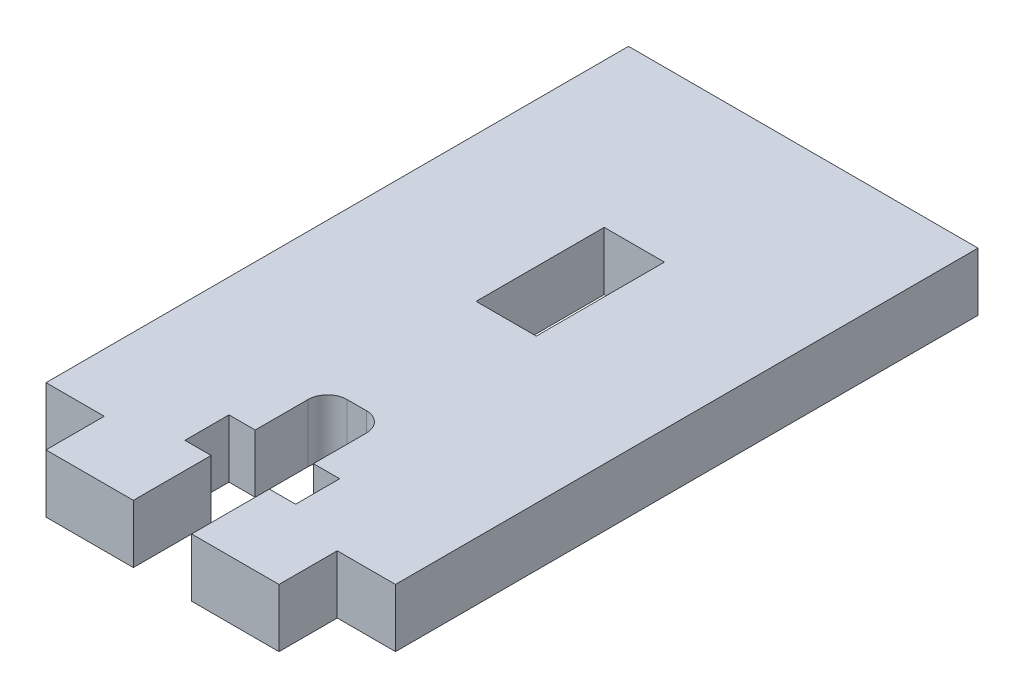
ISO-10303-21;
HEADER;
FILE_DESCRIPTION(('STEP AP214'),'2;1');
FILE_NAME('part.step','',(''),(''),'','','');
FILE_SCHEMA(('AUTOMOTIVE_DESIGN { 1 0 10303 214 1 1 1 1 }'));
ENDSEC;
DATA;
#1=APPLICATION_CONTEXT('core data for automotive mechanical design processes');
#2=APPLICATION_PROTOCOL_DEFINITION('international standard','automotive_design',2000,#1);
#3=PRODUCT_CONTEXT('',#1,'mechanical');
#4=PRODUCT('Part','Part','',(#3));
#5=PRODUCT_RELATED_PRODUCT_CATEGORY('part','',(#4));
#6=PRODUCT_DEFINITION_FORMATION('','',#4);
#7=PRODUCT_DEFINITION_CONTEXT('part definition',#1,'design');
#8=PRODUCT_DEFINITION('design','',#6,#7);
#9=PRODUCT_DEFINITION_SHAPE('','',#8);
#10=(LENGTH_UNIT() NAMED_UNIT(*) SI_UNIT(.MILLI.,.METRE.));
#11=(NAMED_UNIT(*) PLANE_ANGLE_UNIT() SI_UNIT($,.RADIAN.));
#12=(NAMED_UNIT(*) SI_UNIT($,.STERADIAN.) SOLID_ANGLE_UNIT());
#13=UNCERTAINTY_MEASURE_WITH_UNIT(LENGTH_MEASURE(1.E-05),#10,'distance_accuracy_value','');
#14=(GEOMETRIC_REPRESENTATION_CONTEXT(3) GLOBAL_UNCERTAINTY_ASSIGNED_CONTEXT((#13)) GLOBAL_UNIT_ASSIGNED_CONTEXT((#10,
#11,#12)) REPRESENTATION_CONTEXT('',''));
#15=CARTESIAN_POINT('',(0.,0.,0.));
#16=DIRECTION('',(0.,0.,1.));
#17=DIRECTION('',(1.,0.,0.));
#18=AXIS2_PLACEMENT_3D('',#15,#16,#17);
#19=CARTESIAN_POINT('',(-6.,1.5,18.));
#20=DIRECTION('',(0.,0.,-1.));
#21=DIRECTION('',(-1.,0.,0.));
#22=AXIS2_PLACEMENT_3D('',#19,#20,#21);
#23=PLANE('',#22);
#24=DIRECTION('',(1.,0.,0.));
#25=VECTOR('',#24,1.);
#26=CARTESIAN_POINT('',(-6.,-1.5,18.));
#27=LINE('',#26,#25);
#28=CARTESIAN_POINT('',(-6.,-1.5,18.));
#29=VERTEX_POINT('',#28);
#30=CARTESIAN_POINT('',(-1.5,-1.5,18.));
#31=VERTEX_POINT('',#30);
#32=EDGE_CURVE('E367',#29,#31,#27,.T.);
#33=ORIENTED_EDGE('',*,*,#32,.T.);
#34=DIRECTION('',(0.,1.,0.));
#35=VECTOR('',#34,1.);
#36=CARTESIAN_POINT('',(-1.5,-1.5,18.));
#37=LINE('',#36,#35);
#38=CARTESIAN_POINT('',(-1.5,1.5,18.));
#39=VERTEX_POINT('',#38);
#40=EDGE_CURVE('E323',#31,#39,#37,.T.);
#41=ORIENTED_EDGE('',*,*,#40,.T.);
#42=DIRECTION('',(1.,0.,0.));
#43=VECTOR('',#42,1.);
#44=CARTESIAN_POINT('',(-6.,1.5,18.));
#45=LINE('',#44,#43);
#46=CARTESIAN_POINT('',(-6.,1.5,18.));
#47=VERTEX_POINT('',#46);
#48=EDGE_CURVE('E358',#47,#39,#45,.T.);
#49=ORIENTED_EDGE('',*,*,#48,.F.);
#50=DIRECTION('',(0.,-1.,0.));
#51=VECTOR('',#50,1.);
#52=CARTESIAN_POINT('',(-6.,1.5,18.));
#53=LINE('',#52,#51);
#54=EDGE_CURVE('E378',#47,#29,#53,.T.);
#55=ORIENTED_EDGE('',*,*,#54,.T.);
#56=EDGE_LOOP('',(#33,#41,#49,#55));
#57=FACE_BOUND('',#56,.T.);
#58=ADVANCED_FACE('F37',(#57),#23,.F.);
#59=CARTESIAN_POINT('',(-9.,1.5,15.));
#60=DIRECTION('',(0.,0.,-1.));
#61=DIRECTION('',(-1.,0.,0.));
#62=AXIS2_PLACEMENT_3D('',#59,#60,#61);
#63=PLANE('',#62);
#64=DIRECTION('',(0.,-1.,0.));
#65=VECTOR('',#64,1.);
#66=CARTESIAN_POINT('',(-6.,1.5,15.));
#67=LINE('',#66,#65);
#68=CARTESIAN_POINT('',(-6.,1.5,15.));
#69=VERTEX_POINT('',#68);
#70=CARTESIAN_POINT('',(-6.,-1.5,15.));
#71=VERTEX_POINT('',#70);
#72=EDGE_CURVE('E363',#69,#71,#67,.T.);
#73=ORIENTED_EDGE('',*,*,#72,.F.);
#74=DIRECTION('',(1.,0.,0.));
#75=VECTOR('',#74,1.);
#76=CARTESIAN_POINT('',(-9.,1.5,15.));
#77=LINE('',#76,#75);
#78=CARTESIAN_POINT('',(-9.,1.5,15.));
#79=VERTEX_POINT('',#78);
#80=EDGE_CURVE('E387',#79,#69,#77,.T.);
#81=ORIENTED_EDGE('',*,*,#80,.F.);
#82=DIRECTION('',(0.,-1.,0.));
#83=VECTOR('',#82,1.);
#84=CARTESIAN_POINT('',(-9.,1.5,15.));
#85=LINE('',#84,#83);
#86=CARTESIAN_POINT('',(-9.,-1.5,15.));
#87=VERTEX_POINT('',#86);
#88=EDGE_CURVE('E11',#79,#87,#85,.T.);
#89=ORIENTED_EDGE('',*,*,#88,.T.);
#90=DIRECTION('',(1.,0.,0.));
#91=VECTOR('',#90,1.);
#92=CARTESIAN_POINT('',(-9.,-1.5,15.));
#93=LINE('',#92,#91);
#94=EDGE_CURVE('E398',#87,#71,#93,.T.);
#95=ORIENTED_EDGE('',*,*,#94,.T.);
#96=EDGE_LOOP('',(#73,#81,#89,#95));
#97=FACE_BOUND('',#96,.T.);
#98=ADVANCED_FACE('F499',(#97),#63,.F.);
#99=CARTESIAN_POINT('',(-9.,1.5,-15.));
#100=DIRECTION('',(1.,0.,0.));
#101=DIRECTION('',(0.,0.,-1.));
#102=AXIS2_PLACEMENT_3D('',#99,#100,#101);
#103=PLANE('',#102);
#104=DIRECTION('',(0.,0.,1.));
#105=VECTOR('',#104,1.);
#106=CARTESIAN_POINT('',(-9.,-1.5,-15.));
#107=LINE('',#106,#105);
#108=CARTESIAN_POINT('',(-9.,-1.5,-15.));
#109=VERTEX_POINT('',#108);
#110=EDGE_CURVE('E381',#109,#87,#107,.T.);
#111=ORIENTED_EDGE('',*,*,#110,.T.);
#112=ORIENTED_EDGE('',*,*,#88,.F.);
#113=DIRECTION('',(0.,0.,1.));
#114=VECTOR('',#113,1.);
#115=CARTESIAN_POINT('',(-9.,1.5,-15.));
#116=LINE('',#115,#114);
#117=CARTESIAN_POINT('',(-9.,1.5,-15.));
#118=VERTEX_POINT('',#117);
#119=EDGE_CURVE('E382',#118,#79,#116,.T.);
#120=ORIENTED_EDGE('',*,*,#119,.F.);
#121=DIRECTION('',(0.,-1.,0.));
#122=VECTOR('',#121,1.);
#123=CARTESIAN_POINT('',(-9.,1.5,-15.));
#124=LINE('',#123,#122);
#125=EDGE_CURVE('E394',#118,#109,#124,.T.);
#126=ORIENTED_EDGE('',*,*,#125,.T.);
#127=EDGE_LOOP('',(#111,#112,#120,#126));
#128=FACE_BOUND('',#127,.T.);
#129=ADVANCED_FACE('F39',(#128),#103,.F.);
#130=CARTESIAN_POINT('',(6.,1.5,15.));
#131=VERTEX_POINT('',#130);
#132=CARTESIAN_POINT('',(9.,1.5,15.));
#133=VERTEX_POINT('',#132);
#134=EDGE_CURVE('E385',#131,#133,#77,.T.);
#135=ORIENTED_EDGE('',*,*,#134,.F.);
#136=DIRECTION('',(0.,-1.,0.));
#137=VECTOR('',#136,1.);
#138=CARTESIAN_POINT('',(6.,1.5,15.));
#139=LINE('',#138,#137);
#140=CARTESIAN_POINT('',(6.,-1.5,15.));
#141=VERTEX_POINT('',#140);
#142=EDGE_CURVE('E372',#131,#141,#139,.T.);
#143=ORIENTED_EDGE('',*,*,#142,.T.);
#144=CARTESIAN_POINT('',(9.,-1.5,15.));
#145=VERTEX_POINT('',#144);
#146=EDGE_CURVE('E397',#141,#145,#93,.T.);
#147=ORIENTED_EDGE('',*,*,#146,.T.);
#148=DIRECTION('',(0.,-1.,0.));
#149=VECTOR('',#148,1.);
#150=CARTESIAN_POINT('',(9.,1.5,15.));
#151=LINE('',#150,#149);
#152=EDGE_CURVE('E45',#133,#145,#151,.T.);
#153=ORIENTED_EDGE('',*,*,#152,.F.);
#154=EDGE_LOOP('',(#135,#143,#147,#153));
#155=FACE_BOUND('',#154,.T.);
#156=ADVANCED_FACE('F433',(#155),#63,.F.);
#157=CARTESIAN_POINT('',(9.,1.5,-15.));
#158=DIRECTION('',(-1.,0.,0.));
#159=DIRECTION('',(0.,0.,1.));
#160=AXIS2_PLACEMENT_3D('',#157,#158,#159);
#161=PLANE('',#160);
#162=DIRECTION('',(0.,0.,-1.));
#163=VECTOR('',#162,1.);
#164=CARTESIAN_POINT('',(9.,-1.5,-15.));
#165=LINE('',#164,#163);
#166=CARTESIAN_POINT('',(9.,-1.5,-15.));
#167=VERTEX_POINT('',#166);
#168=EDGE_CURVE('E401',#145,#167,#165,.T.);
#169=ORIENTED_EDGE('',*,*,#168,.T.);
#170=DIRECTION('',(0.,-1.,0.));
#171=VECTOR('',#170,1.);
#172=CARTESIAN_POINT('',(9.,1.5,-15.));
#173=LINE('',#172,#171);
#174=CARTESIAN_POINT('',(9.,1.5,-15.));
#175=VERTEX_POINT('',#174);
#176=EDGE_CURVE('E406',#175,#167,#173,.T.);
#177=ORIENTED_EDGE('',*,*,#176,.F.);
#178=DIRECTION('',(0.,0.,-1.));
#179=VECTOR('',#178,1.);
#180=CARTESIAN_POINT('',(9.,1.5,-15.));
#181=LINE('',#180,#179);
#182=EDGE_CURVE('E390',#133,#175,#181,.T.);
#183=ORIENTED_EDGE('',*,*,#182,.F.);
#184=ORIENTED_EDGE('',*,*,#152,.T.);
#185=EDGE_LOOP('',(#169,#177,#183,#184));
#186=FACE_BOUND('',#185,.T.);
#187=ADVANCED_FACE('F413',(#186),#161,.F.);
#188=CARTESIAN_POINT('',(-9.,1.5,-15.));
#189=DIRECTION('',(0.,0.,1.));
#190=DIRECTION('',(1.,0.,0.));
#191=AXIS2_PLACEMENT_3D('',#188,#189,#190);
#192=PLANE('',#191);
#193=DIRECTION('',(-1.,0.,0.));
#194=VECTOR('',#193,1.);
#195=CARTESIAN_POINT('',(-9.,-1.5,-15.));
#196=LINE('',#195,#194);
#197=EDGE_CURVE('E386',#167,#109,#196,.T.);
#198=ORIENTED_EDGE('',*,*,#197,.T.);
#199=ORIENTED_EDGE('',*,*,#125,.F.);
#200=DIRECTION('',(-1.,0.,0.));
#201=VECTOR('',#200,1.);
#202=CARTESIAN_POINT('',(-9.,1.5,-15.));
#203=LINE('',#202,#201);
#204=EDGE_CURVE('E392',#175,#118,#203,.T.);
#205=ORIENTED_EDGE('',*,*,#204,.F.);
#206=ORIENTED_EDGE('',*,*,#176,.T.);
#207=EDGE_LOOP('',(#198,#199,#205,#206));
#208=FACE_BOUND('',#207,.T.);
#209=ADVANCED_FACE('F425',(#208),#192,.F.);
#210=CARTESIAN_POINT('',(0.,1.5,0.));
#211=DIRECTION('',(0.,1.,0.));
#212=DIRECTION('',(0.,0.,1.));
#213=AXIS2_PLACEMENT_3D('',#210,#211,#212);
#214=PLANE('',#213);
#215=DIRECTION('',(0.,0.,1.));
#216=VECTOR('',#215,1.);
#217=CARTESIAN_POINT('',(-1.55,1.5,-6.3));
#218=LINE('',#217,#216);
#219=CARTESIAN_POINT('',(-1.55,1.5,-6.3));
#220=VERTEX_POINT('',#219);
#221=CARTESIAN_POINT('',(-1.55,1.5,0.299999999999996));
#222=VERTEX_POINT('',#221);
#223=EDGE_CURVE('E52',#220,#222,#218,.T.);
#224=ORIENTED_EDGE('',*,*,#223,.F.);
#225=DIRECTION('',(-1.,0.,0.));
#226=VECTOR('',#225,1.);
#227=CARTESIAN_POINT('',(-1.55,1.5,-6.3));
#228=LINE('',#227,#226);
#229=CARTESIAN_POINT('',(1.55,1.5,-6.3));
#230=VERTEX_POINT('',#229);
#231=EDGE_CURVE('E228',#230,#220,#228,.T.);
#232=ORIENTED_EDGE('',*,*,#231,.F.);
#233=DIRECTION('',(0.,0.,-1.));
#234=VECTOR('',#233,1.);
#235=CARTESIAN_POINT('',(1.55,1.5,-6.3));
#236=LINE('',#235,#234);
#237=CARTESIAN_POINT('',(1.55,1.5,0.299999999999996));
#238=VERTEX_POINT('',#237);
#239=EDGE_CURVE('E212',#238,#230,#236,.T.);
#240=ORIENTED_EDGE('',*,*,#239,.F.);
#241=DIRECTION('',(1.,0.,0.));
#242=VECTOR('',#241,1.);
#243=CARTESIAN_POINT('',(-1.55,1.5,0.299999999999996));
#244=LINE('',#243,#242);
#245=EDGE_CURVE('E221',#222,#238,#244,.T.);
#246=ORIENTED_EDGE('',*,*,#245,.F.);
#247=EDGE_LOOP('',(#224,#232,#240,#246));
#248=FACE_BOUND('',#247,.T.);
#249=DIRECTION('',(0.,0.,1.));
#250=VECTOR('',#249,1.);
#251=CARTESIAN_POINT('',(-1.5,1.5,18.));
#252=LINE('',#251,#250);
#253=CARTESIAN_POINT('',(-1.5,1.5,13.996114825644));
#254=VERTEX_POINT('',#253);
#255=EDGE_CURVE('E244',#254,#39,#252,.T.);
#256=ORIENTED_EDGE('',*,*,#255,.F.);
#257=DIRECTION('',(1.,0.,0.));
#258=VECTOR('',#257,1.);
#259=CARTESIAN_POINT('',(-2.85,1.5,13.996114825644));
#260=LINE('',#259,#258);
#261=CARTESIAN_POINT('',(-2.85,1.5,13.996114825644));
#262=VERTEX_POINT('',#261);
#263=EDGE_CURVE('E281',#262,#254,#260,.T.);
#264=ORIENTED_EDGE('',*,*,#263,.F.);
#265=DIRECTION('',(0.,0.,1.));
#266=VECTOR('',#265,1.);
#267=CARTESIAN_POINT('',(-2.85,1.5,11.726114825644));
#268=LINE('',#267,#266);
#269=CARTESIAN_POINT('',(-2.85,1.5,11.726114825644));
#270=VERTEX_POINT('',#269);
#271=EDGE_CURVE('E278',#270,#262,#268,.T.);
#272=ORIENTED_EDGE('',*,*,#271,.F.);
#273=DIRECTION('',(-1.,0.,0.));
#274=VECTOR('',#273,1.);
#275=CARTESIAN_POINT('',(-2.85,1.5,11.726114825644));
#276=LINE('',#275,#274);
#277=CARTESIAN_POINT('',(-1.5,1.5,11.726114825644));
#278=VERTEX_POINT('',#277);
#279=EDGE_CURVE('E275',#278,#270,#276,.T.);
#280=ORIENTED_EDGE('',*,*,#279,.F.);
#281=DIRECTION('',(0.,0.,1.));
#282=VECTOR('',#281,1.);
#283=CARTESIAN_POINT('',(-1.5,1.5,11.726114825644));
#284=LINE('',#283,#282);
#285=CARTESIAN_POINT('',(-1.5,1.5,9.));
#286=VERTEX_POINT('',#285);
#287=EDGE_CURVE('E272',#286,#278,#284,.T.);
#288=ORIENTED_EDGE('',*,*,#287,.F.);
#289=CARTESIAN_POINT('',(-0.5,1.5,8.99999999999999));
#290=DIRECTION('',(0.,1.,0.));
#291=DIRECTION('',(0.,0.,-1.));
#292=AXIS2_PLACEMENT_3D('',#289,#290,#291);
#293=CIRCLE('',#292,1.);
#294=CARTESIAN_POINT('',(-0.499999999999992,1.5,7.99999999999999));
#295=VERTEX_POINT('',#294);
#296=EDGE_CURVE('E269',#295,#286,#293,.T.);
#297=ORIENTED_EDGE('',*,*,#296,.F.);
#298=DIRECTION('',(-1.,0.,0.));
#299=VECTOR('',#298,1.);
#300=CARTESIAN_POINT('',(-0.499999999999992,1.5,7.99999999999999));
#301=LINE('',#300,#299);
#302=CARTESIAN_POINT('',(0.499999999999994,1.5,7.99999999999999));
#303=VERTEX_POINT('',#302);
#304=EDGE_CURVE('E266',#303,#295,#301,.T.);
#305=ORIENTED_EDGE('',*,*,#304,.F.);
#306=CARTESIAN_POINT('',(0.500000000000001,1.5,8.99999999999999));
#307=DIRECTION('',(0.,1.,0.));
#308=DIRECTION('',(0.,0.,-1.));
#309=AXIS2_PLACEMENT_3D('',#306,#307,#308);
#310=CIRCLE('',#309,1.);
#311=CARTESIAN_POINT('',(1.5,1.5,9.));
#312=VERTEX_POINT('',#311);
#313=EDGE_CURVE('E263',#312,#303,#310,.T.);
#314=ORIENTED_EDGE('',*,*,#313,.F.);
#315=DIRECTION('',(0.,0.,-1.));
#316=VECTOR('',#315,1.);
#317=CARTESIAN_POINT('',(1.5,1.5,11.726114825644));
#318=LINE('',#317,#316);
#319=CARTESIAN_POINT('',(1.5,1.5,11.726114825644));
#320=VERTEX_POINT('',#319);
#321=EDGE_CURVE('E260',#320,#312,#318,.T.);
#322=ORIENTED_EDGE('',*,*,#321,.F.);
#323=DIRECTION('',(-1.,0.,0.));
#324=VECTOR('',#323,1.);
#325=CARTESIAN_POINT('',(1.5,1.5,11.726114825644));
#326=LINE('',#325,#324);
#327=CARTESIAN_POINT('',(2.85,1.5,11.726114825644));
#328=VERTEX_POINT('',#327);
#329=EDGE_CURVE('E257',#328,#320,#326,.T.);
#330=ORIENTED_EDGE('',*,*,#329,.F.);
#331=DIRECTION('',(0.,0.,-1.));
#332=VECTOR('',#331,1.);
#333=CARTESIAN_POINT('',(2.85,1.5,11.726114825644));
#334=LINE('',#333,#332);
#335=CARTESIAN_POINT('',(2.85,1.5,13.996114825644));
#336=VERTEX_POINT('',#335);
#337=EDGE_CURVE('E254',#336,#328,#334,.T.);
#338=ORIENTED_EDGE('',*,*,#337,.F.);
#339=DIRECTION('',(1.,0.,0.));
#340=VECTOR('',#339,1.);
#341=CARTESIAN_POINT('',(1.5,1.5,13.996114825644));
#342=LINE('',#341,#340);
#343=CARTESIAN_POINT('',(1.5,1.5,13.996114825644));
#344=VERTEX_POINT('',#343);
#345=EDGE_CURVE('E251',#344,#336,#342,.T.);
#346=ORIENTED_EDGE('',*,*,#345,.F.);
#347=DIRECTION('',(0.,0.,-1.));
#348=VECTOR('',#347,1.);
#349=CARTESIAN_POINT('',(1.5,1.5,18.));
#350=LINE('',#349,#348);
#351=CARTESIAN_POINT('',(1.5,1.5,18.));
#352=VERTEX_POINT('',#351);
#353=EDGE_CURVE('E248',#352,#344,#350,.T.);
#354=ORIENTED_EDGE('',*,*,#353,.F.);
#355=CARTESIAN_POINT('',(6.,1.5,18.));
#356=VERTEX_POINT('',#355);
#357=EDGE_CURVE('E356',#352,#356,#45,.T.);
#358=ORIENTED_EDGE('',*,*,#357,.T.);
#359=DIRECTION('',(0.,0.,-1.));
#360=VECTOR('',#359,1.);
#361=CARTESIAN_POINT('',(6.,1.5,15.));
#362=LINE('',#361,#360);
#363=EDGE_CURVE('E361',#356,#131,#362,.T.);
#364=ORIENTED_EDGE('',*,*,#363,.T.);
#365=ORIENTED_EDGE('',*,*,#134,.T.);
#366=ORIENTED_EDGE('',*,*,#182,.T.);
#367=ORIENTED_EDGE('',*,*,#204,.T.);
#368=ORIENTED_EDGE('',*,*,#119,.T.);
#369=ORIENTED_EDGE('',*,*,#80,.T.);
#370=DIRECTION('',(0.,0.,1.));
#371=VECTOR('',#370,1.);
#372=CARTESIAN_POINT('',(-6.,1.5,15.));
#373=LINE('',#372,#371);
#374=EDGE_CURVE('E353',#69,#47,#373,.T.);
#375=ORIENTED_EDGE('',*,*,#374,.T.);
#376=ORIENTED_EDGE('',*,*,#48,.T.);
#377=EDGE_LOOP('',(#256,#264,#272,#280,#288,#297,#305,#314,#322,#330,#338,#346,#354,#358,#364,
#365,#366,#367,#368,#369,#375,#376));
#378=FACE_BOUND('',#377,.T.);
#379=ADVANCED_FACE('F225',(#248,#378),#214,.T.);
#380=CARTESIAN_POINT('',(0.,-1.5,0.));
#381=DIRECTION('',(0.,1.,0.));
#382=DIRECTION('',(0.,0.,1.));
#383=AXIS2_PLACEMENT_3D('',#380,#381,#382);
#384=PLANE('',#383);
#385=DIRECTION('',(-1.,0.,0.));
#386=VECTOR('',#385,1.);
#387=CARTESIAN_POINT('',(-1.55,-1.5,-6.3));
#388=LINE('',#387,#386);
#389=CARTESIAN_POINT('',(1.55,-1.5,-6.3));
#390=VERTEX_POINT('',#389);
#391=CARTESIAN_POINT('',(-1.55,-1.5,-6.3));
#392=VERTEX_POINT('',#391);
#393=EDGE_CURVE('E239',#390,#392,#388,.T.);
#394=ORIENTED_EDGE('',*,*,#393,.T.);
#395=DIRECTION('',(0.,0.,1.));
#396=VECTOR('',#395,1.);
#397=CARTESIAN_POINT('',(-1.55,-1.5,-6.3));
#398=LINE('',#397,#396);
#399=CARTESIAN_POINT('',(-1.55,-1.5,0.299999999999996));
#400=VERTEX_POINT('',#399);
#401=EDGE_CURVE('E230',#392,#400,#398,.T.);
#402=ORIENTED_EDGE('',*,*,#401,.T.);
#403=DIRECTION('',(1.,0.,0.));
#404=VECTOR('',#403,1.);
#405=CARTESIAN_POINT('',(-1.55,-1.5,0.299999999999996));
#406=LINE('',#405,#404);
#407=CARTESIAN_POINT('',(1.55,-1.5,0.299999999999996));
#408=VERTEX_POINT('',#407);
#409=EDGE_CURVE('E236',#400,#408,#406,.T.);
#410=ORIENTED_EDGE('',*,*,#409,.T.);
#411=DIRECTION('',(0.,0.,-1.));
#412=VECTOR('',#411,1.);
#413=CARTESIAN_POINT('',(1.55,-1.5,-6.3));
#414=LINE('',#413,#412);
#415=EDGE_CURVE('E60',#408,#390,#414,.T.);
#416=ORIENTED_EDGE('',*,*,#415,.T.);
#417=EDGE_LOOP('',(#394,#402,#410,#416));
#418=FACE_BOUND('',#417,.T.);
#419=DIRECTION('',(1.,0.,0.));
#420=VECTOR('',#419,1.);
#421=CARTESIAN_POINT('',(-2.85,-1.5,13.996114825644));
#422=LINE('',#421,#420);
#423=CARTESIAN_POINT('',(-2.85,-1.5,13.996114825644));
#424=VERTEX_POINT('',#423);
#425=CARTESIAN_POINT('',(-1.5,-1.5,13.996114825644));
#426=VERTEX_POINT('',#425);
#427=EDGE_CURVE('E320',#424,#426,#422,.T.);
#428=ORIENTED_EDGE('',*,*,#427,.T.);
#429=DIRECTION('',(0.,0.,1.));
#430=VECTOR('',#429,1.);
#431=CARTESIAN_POINT('',(-1.5,-1.5,18.));
#432=LINE('',#431,#430);
#433=EDGE_CURVE('E284',#426,#31,#432,.T.);
#434=ORIENTED_EDGE('',*,*,#433,.T.);
#435=ORIENTED_EDGE('',*,*,#32,.F.);
#436=DIRECTION('',(0.,0.,1.));
#437=VECTOR('',#436,1.);
#438=CARTESIAN_POINT('',(-6.,-1.5,15.));
#439=LINE('',#438,#437);
#440=EDGE_CURVE('E326',#71,#29,#439,.T.);
#441=ORIENTED_EDGE('',*,*,#440,.F.);
#442=ORIENTED_EDGE('',*,*,#94,.F.);
#443=ORIENTED_EDGE('',*,*,#110,.F.);
#444=ORIENTED_EDGE('',*,*,#197,.F.);
#445=ORIENTED_EDGE('',*,*,#168,.F.);
#446=ORIENTED_EDGE('',*,*,#146,.F.);
#447=DIRECTION('',(0.,0.,-1.));
#448=VECTOR('',#447,1.);
#449=CARTESIAN_POINT('',(6.,-1.5,15.));
#450=LINE('',#449,#448);
#451=CARTESIAN_POINT('',(6.,-1.5,18.));
#452=VERTEX_POINT('',#451);
#453=EDGE_CURVE('E357',#452,#141,#450,.T.);
#454=ORIENTED_EDGE('',*,*,#453,.F.);
#455=CARTESIAN_POINT('',(1.5,-1.5,18.));
#456=VERTEX_POINT('',#455);
#457=EDGE_CURVE('E366',#456,#452,#27,.T.);
#458=ORIENTED_EDGE('',*,*,#457,.F.);
#459=DIRECTION('',(0.,0.,-1.));
#460=VECTOR('',#459,1.);
#461=CARTESIAN_POINT('',(1.5,-1.5,18.));
#462=LINE('',#461,#460);
#463=CARTESIAN_POINT('',(1.5,-1.5,13.996114825644));
#464=VERTEX_POINT('',#463);
#465=EDGE_CURVE('E287',#456,#464,#462,.T.);
#466=ORIENTED_EDGE('',*,*,#465,.T.);
#467=DIRECTION('',(1.,0.,0.));
#468=VECTOR('',#467,1.);
#469=CARTESIAN_POINT('',(1.5,-1.5,13.996114825644));
#470=LINE('',#469,#468);
#471=CARTESIAN_POINT('',(2.85,-1.5,13.996114825644));
#472=VERTEX_POINT('',#471);
#473=EDGE_CURVE('E290',#464,#472,#470,.T.);
#474=ORIENTED_EDGE('',*,*,#473,.T.);
#475=DIRECTION('',(0.,0.,-1.));
#476=VECTOR('',#475,1.);
#477=CARTESIAN_POINT('',(2.85,-1.5,11.726114825644));
#478=LINE('',#477,#476);
#479=CARTESIAN_POINT('',(2.85,-1.5,11.726114825644));
#480=VERTEX_POINT('',#479);
#481=EDGE_CURVE('E293',#472,#480,#478,.T.);
#482=ORIENTED_EDGE('',*,*,#481,.T.);
#483=DIRECTION('',(-1.,0.,0.));
#484=VECTOR('',#483,1.);
#485=CARTESIAN_POINT('',(1.5,-1.5,11.726114825644));
#486=LINE('',#485,#484);
#487=CARTESIAN_POINT('',(1.5,-1.5,11.726114825644));
#488=VERTEX_POINT('',#487);
#489=EDGE_CURVE('E296',#480,#488,#486,.T.);
#490=ORIENTED_EDGE('',*,*,#489,.T.);
#491=DIRECTION('',(0.,0.,-1.));
#492=VECTOR('',#491,1.);
#493=CARTESIAN_POINT('',(1.5,-1.5,11.726114825644));
#494=LINE('',#493,#492);
#495=CARTESIAN_POINT('',(1.5,-1.5,9.));
#496=VERTEX_POINT('',#495);
#497=EDGE_CURVE('E299',#488,#496,#494,.T.);
#498=ORIENTED_EDGE('',*,*,#497,.T.);
#499=CARTESIAN_POINT('',(0.500000000000001,-1.5,8.99999999999999));
#500=DIRECTION('',(0.,1.,0.));
#501=DIRECTION('',(0.,0.,-1.));
#502=AXIS2_PLACEMENT_3D('',#499,#500,#501);
#503=CIRCLE('',#502,1.);
#504=CARTESIAN_POINT('',(0.499999999999994,-1.5,7.99999999999999));
#505=VERTEX_POINT('',#504);
#506=EDGE_CURVE('E302',#496,#505,#503,.T.);
#507=ORIENTED_EDGE('',*,*,#506,.T.);
#508=DIRECTION('',(-1.,0.,0.));
#509=VECTOR('',#508,1.);
#510=CARTESIAN_POINT('',(-0.499999999999992,-1.5,7.99999999999999));
#511=LINE('',#510,#509);
#512=CARTESIAN_POINT('',(-0.499999999999992,-1.5,7.99999999999999));
#513=VERTEX_POINT('',#512);
#514=EDGE_CURVE('E305',#505,#513,#511,.T.);
#515=ORIENTED_EDGE('',*,*,#514,.T.);
#516=CARTESIAN_POINT('',(-0.5,-1.5,8.99999999999999));
#517=DIRECTION('',(0.,1.,0.));
#518=DIRECTION('',(0.,0.,-1.));
#519=AXIS2_PLACEMENT_3D('',#516,#517,#518);
#520=CIRCLE('',#519,1.);
#521=CARTESIAN_POINT('',(-1.5,-1.5,9.));
#522=VERTEX_POINT('',#521);
#523=EDGE_CURVE('E308',#513,#522,#520,.T.);
#524=ORIENTED_EDGE('',*,*,#523,.T.);
#525=DIRECTION('',(0.,0.,1.));
#526=VECTOR('',#525,1.);
#527=CARTESIAN_POINT('',(-1.5,-1.5,11.726114825644));
#528=LINE('',#527,#526);
#529=CARTESIAN_POINT('',(-1.5,-1.5,11.726114825644));
#530=VERTEX_POINT('',#529);
#531=EDGE_CURVE('E311',#522,#530,#528,.T.);
#532=ORIENTED_EDGE('',*,*,#531,.T.);
#533=DIRECTION('',(-1.,0.,0.));
#534=VECTOR('',#533,1.);
#535=CARTESIAN_POINT('',(-2.85,-1.5,11.726114825644));
#536=LINE('',#535,#534);
#537=CARTESIAN_POINT('',(-2.85,-1.5,11.726114825644));
#538=VERTEX_POINT('',#537);
#539=EDGE_CURVE('E314',#530,#538,#536,.T.);
#540=ORIENTED_EDGE('',*,*,#539,.T.);
#541=DIRECTION('',(0.,0.,1.));
#542=VECTOR('',#541,1.);
#543=CARTESIAN_POINT('',(-2.85,-1.5,11.726114825644));
#544=LINE('',#543,#542);
#545=EDGE_CURVE('E317',#538,#424,#544,.T.);
#546=ORIENTED_EDGE('',*,*,#545,.T.);
#547=EDGE_LOOP('',(#428,#434,#435,#441,#442,#443,#444,#445,#446,#454,#458,#466,#474,#482,#490,
#498,#507,#515,#524,#532,#540,#546));
#548=FACE_BOUND('',#547,.T.);
#549=ADVANCED_FACE('F420',(#418,#548),#384,.F.);
#550=CARTESIAN_POINT('',(-6.,1.5,15.));
#551=DIRECTION('',(1.,0.,0.));
#552=DIRECTION('',(0.,0.,-1.));
#553=AXIS2_PLACEMENT_3D('',#550,#551,#552);
#554=PLANE('',#553);
#555=ORIENTED_EDGE('',*,*,#440,.T.);
#556=ORIENTED_EDGE('',*,*,#54,.F.);
#557=ORIENTED_EDGE('',*,*,#374,.F.);
#558=ORIENTED_EDGE('',*,*,#72,.T.);
#559=EDGE_LOOP('',(#555,#556,#557,#558));
#560=FACE_BOUND('',#559,.T.);
#561=ADVANCED_FACE('F496',(#560),#554,.F.);
#562=ORIENTED_EDGE('',*,*,#357,.F.);
#563=DIRECTION('',(0.,1.,0.));
#564=VECTOR('',#563,1.);
#565=CARTESIAN_POINT('',(1.5,-1.5,18.));
#566=LINE('',#565,#564);
#567=EDGE_CURVE('E349',#456,#352,#566,.T.);
#568=ORIENTED_EDGE('',*,*,#567,.F.);
#569=ORIENTED_EDGE('',*,*,#457,.T.);
#570=DIRECTION('',(0.,-1.,0.));
#571=VECTOR('',#570,1.);
#572=CARTESIAN_POINT('',(6.,1.5,18.));
#573=LINE('',#572,#571);
#574=EDGE_CURVE('E375',#356,#452,#573,.T.);
#575=ORIENTED_EDGE('',*,*,#574,.F.);
#576=EDGE_LOOP('',(#562,#568,#569,#575));
#577=FACE_BOUND('',#576,.T.);
#578=ADVANCED_FACE('F441',(#577),#23,.F.);
#579=CARTESIAN_POINT('',(6.,1.5,15.));
#580=DIRECTION('',(-1.,0.,0.));
#581=DIRECTION('',(0.,0.,1.));
#582=AXIS2_PLACEMENT_3D('',#579,#580,#581);
#583=PLANE('',#582);
#584=ORIENTED_EDGE('',*,*,#453,.T.);
#585=ORIENTED_EDGE('',*,*,#142,.F.);
#586=ORIENTED_EDGE('',*,*,#363,.F.);
#587=ORIENTED_EDGE('',*,*,#574,.T.);
#588=EDGE_LOOP('',(#584,#585,#586,#587));
#589=FACE_BOUND('',#588,.T.);
#590=ADVANCED_FACE('F435',(#589),#583,.F.);
#591=CARTESIAN_POINT('',(-1.5,-1.5,18.));
#592=DIRECTION('',(-1.,0.,0.));
#593=DIRECTION('',(0.,0.,1.));
#594=AXIS2_PLACEMENT_3D('',#591,#592,#593);
#595=PLANE('',#594);
#596=ORIENTED_EDGE('',*,*,#40,.F.);
#597=ORIENTED_EDGE('',*,*,#433,.F.);
#598=DIRECTION('',(0.,1.,0.));
#599=VECTOR('',#598,1.);
#600=CARTESIAN_POINT('',(-1.5,-1.5,13.996114825644));
#601=LINE('',#600,#599);
#602=EDGE_CURVE('E324',#426,#254,#601,.T.);
#603=ORIENTED_EDGE('',*,*,#602,.T.);
#604=ORIENTED_EDGE('',*,*,#255,.T.);
#605=EDGE_LOOP('',(#596,#597,#603,#604));
#606=FACE_BOUND('',#605,.T.);
#607=ADVANCED_FACE('F491',(#606),#595,.F.);
#608=CARTESIAN_POINT('',(-2.85,-1.5,13.996114825644));
#609=DIRECTION('',(0.,0.,1.));
#610=DIRECTION('',(1.,0.,0.));
#611=AXIS2_PLACEMENT_3D('',#608,#609,#610);
#612=PLANE('',#611);
#613=ORIENTED_EDGE('',*,*,#602,.F.);
#614=ORIENTED_EDGE('',*,*,#427,.F.);
#615=DIRECTION('',(0.,1.,0.));
#616=VECTOR('',#615,1.);
#617=CARTESIAN_POINT('',(-2.85,-1.5,13.996114825644));
#618=LINE('',#617,#616);
#619=EDGE_CURVE('E327',#424,#262,#618,.T.);
#620=ORIENTED_EDGE('',*,*,#619,.T.);
#621=ORIENTED_EDGE('',*,*,#263,.T.);
#622=EDGE_LOOP('',(#613,#614,#620,#621));
#623=FACE_BOUND('',#622,.T.);
#624=ADVANCED_FACE('F488',(#623),#612,.F.);
#625=CARTESIAN_POINT('',(-2.85,-1.5,11.726114825644));
#626=DIRECTION('',(-1.,0.,0.));
#627=DIRECTION('',(0.,0.,1.));
#628=AXIS2_PLACEMENT_3D('',#625,#626,#627);
#629=PLANE('',#628);
#630=ORIENTED_EDGE('',*,*,#619,.F.);
#631=ORIENTED_EDGE('',*,*,#545,.F.);
#632=DIRECTION('',(0.,1.,0.));
#633=VECTOR('',#632,1.);
#634=CARTESIAN_POINT('',(-2.85,-1.5,11.726114825644));
#635=LINE('',#634,#633);
#636=EDGE_CURVE('E329',#538,#270,#635,.T.);
#637=ORIENTED_EDGE('',*,*,#636,.T.);
#638=ORIENTED_EDGE('',*,*,#271,.T.);
#639=EDGE_LOOP('',(#630,#631,#637,#638));
#640=FACE_BOUND('',#639,.T.);
#641=ADVANCED_FACE('F484',(#640),#629,.F.);
#642=CARTESIAN_POINT('',(-2.85,-1.5,11.726114825644));
#643=DIRECTION('',(0.,0.,-1.));
#644=DIRECTION('',(-1.,0.,0.));
#645=AXIS2_PLACEMENT_3D('',#642,#643,#644);
#646=PLANE('',#645);
#647=ORIENTED_EDGE('',*,*,#636,.F.);
#648=ORIENTED_EDGE('',*,*,#539,.F.);
#649=DIRECTION('',(0.,1.,0.));
#650=VECTOR('',#649,1.);
#651=CARTESIAN_POINT('',(-1.5,-1.5,11.726114825644));
#652=LINE('',#651,#650);
#653=EDGE_CURVE('E331',#530,#278,#652,.T.);
#654=ORIENTED_EDGE('',*,*,#653,.T.);
#655=ORIENTED_EDGE('',*,*,#279,.T.);
#656=EDGE_LOOP('',(#647,#648,#654,#655));
#657=FACE_BOUND('',#656,.T.);
#658=ADVANCED_FACE('F480',(#657),#646,.F.);
#659=CARTESIAN_POINT('',(-1.5,-1.5,11.726114825644));
#660=DIRECTION('',(-1.,0.,0.));
#661=DIRECTION('',(0.,0.,1.));
#662=AXIS2_PLACEMENT_3D('',#659,#660,#661);
#663=PLANE('',#662);
#664=ORIENTED_EDGE('',*,*,#653,.F.);
#665=ORIENTED_EDGE('',*,*,#531,.F.);
#666=DIRECTION('',(0.,1.,0.));
#667=VECTOR('',#666,1.);
#668=CARTESIAN_POINT('',(-1.5,-1.5,9.));
#669=LINE('',#668,#667);
#670=EDGE_CURVE('E333',#522,#286,#669,.T.);
#671=ORIENTED_EDGE('',*,*,#670,.T.);
#672=ORIENTED_EDGE('',*,*,#287,.T.);
#673=EDGE_LOOP('',(#664,#665,#671,#672));
#674=FACE_BOUND('',#673,.T.);
#675=ADVANCED_FACE('F476',(#674),#663,.F.);
#676=CARTESIAN_POINT('',(-0.5,-1.5,8.99999999999999));
#677=DIRECTION('',(0.,1.,0.));
#678=DIRECTION('',(0.,0.,1.));
#679=AXIS2_PLACEMENT_3D('',#676,#677,#678);
#680=CYLINDRICAL_SURFACE('',#679,1.);
#681=ORIENTED_EDGE('',*,*,#670,.F.);
#682=ORIENTED_EDGE('',*,*,#523,.F.);
#683=DIRECTION('',(0.,1.,0.));
#684=VECTOR('',#683,1.);
#685=CARTESIAN_POINT('',(-0.499999999999992,-1.5,7.99999999999999));
#686=LINE('',#685,#684);
#687=EDGE_CURVE('E335',#513,#295,#686,.T.);
#688=ORIENTED_EDGE('',*,*,#687,.T.);
#689=ORIENTED_EDGE('',*,*,#296,.T.);
#690=EDGE_LOOP('',(#681,#682,#688,#689));
#691=FACE_BOUND('',#690,.T.);
#692=ADVANCED_FACE('F472',(#691),#680,.F.);
#693=CARTESIAN_POINT('',(-0.499999999999992,-1.5,7.99999999999999));
#694=DIRECTION('',(0.,0.,-1.));
#695=DIRECTION('',(-1.,0.,0.));
#696=AXIS2_PLACEMENT_3D('',#693,#694,#695);
#697=PLANE('',#696);
#698=ORIENTED_EDGE('',*,*,#687,.F.);
#699=ORIENTED_EDGE('',*,*,#514,.F.);
#700=DIRECTION('',(0.,1.,0.));
#701=VECTOR('',#700,1.);
#702=CARTESIAN_POINT('',(0.499999999999994,-1.5,7.99999999999999));
#703=LINE('',#702,#701);
#704=EDGE_CURVE('E337',#505,#303,#703,.T.);
#705=ORIENTED_EDGE('',*,*,#704,.T.);
#706=ORIENTED_EDGE('',*,*,#304,.T.);
#707=EDGE_LOOP('',(#698,#699,#705,#706));
#708=FACE_BOUND('',#707,.T.);
#709=ADVANCED_FACE('F468',(#708),#697,.F.);
#710=CARTESIAN_POINT('',(0.500000000000001,-1.5,8.99999999999999));
#711=DIRECTION('',(0.,1.,0.));
#712=DIRECTION('',(0.,0.,1.));
#713=AXIS2_PLACEMENT_3D('',#710,#711,#712);
#714=CYLINDRICAL_SURFACE('',#713,1.);
#715=ORIENTED_EDGE('',*,*,#704,.F.);
#716=ORIENTED_EDGE('',*,*,#506,.F.);
#717=DIRECTION('',(0.,1.,0.));
#718=VECTOR('',#717,1.);
#719=CARTESIAN_POINT('',(1.5,-1.5,9.));
#720=LINE('',#719,#718);
#721=EDGE_CURVE('E339',#496,#312,#720,.T.);
#722=ORIENTED_EDGE('',*,*,#721,.T.);
#723=ORIENTED_EDGE('',*,*,#313,.T.);
#724=EDGE_LOOP('',(#715,#716,#722,#723));
#725=FACE_BOUND('',#724,.T.);
#726=ADVANCED_FACE('F464',(#725),#714,.F.);
#727=CARTESIAN_POINT('',(1.5,-1.5,11.726114825644));
#728=DIRECTION('',(1.,0.,0.));
#729=DIRECTION('',(0.,0.,-1.));
#730=AXIS2_PLACEMENT_3D('',#727,#728,#729);
#731=PLANE('',#730);
#732=ORIENTED_EDGE('',*,*,#721,.F.);
#733=ORIENTED_EDGE('',*,*,#497,.F.);
#734=DIRECTION('',(0.,1.,0.));
#735=VECTOR('',#734,1.);
#736=CARTESIAN_POINT('',(1.5,-1.5,11.726114825644));
#737=LINE('',#736,#735);
#738=EDGE_CURVE('E341',#488,#320,#737,.T.);
#739=ORIENTED_EDGE('',*,*,#738,.T.);
#740=ORIENTED_EDGE('',*,*,#321,.T.);
#741=EDGE_LOOP('',(#732,#733,#739,#740));
#742=FACE_BOUND('',#741,.T.);
#743=ADVANCED_FACE('F460',(#742),#731,.F.);
#744=CARTESIAN_POINT('',(1.5,-1.5,11.726114825644));
#745=DIRECTION('',(0.,0.,-1.));
#746=DIRECTION('',(-1.,0.,0.));
#747=AXIS2_PLACEMENT_3D('',#744,#745,#746);
#748=PLANE('',#747);
#749=ORIENTED_EDGE('',*,*,#738,.F.);
#750=ORIENTED_EDGE('',*,*,#489,.F.);
#751=DIRECTION('',(0.,1.,0.));
#752=VECTOR('',#751,1.);
#753=CARTESIAN_POINT('',(2.85,-1.5,11.726114825644));
#754=LINE('',#753,#752);
#755=EDGE_CURVE('E343',#480,#328,#754,.T.);
#756=ORIENTED_EDGE('',*,*,#755,.T.);
#757=ORIENTED_EDGE('',*,*,#329,.T.);
#758=EDGE_LOOP('',(#749,#750,#756,#757));
#759=FACE_BOUND('',#758,.T.);
#760=ADVANCED_FACE('F456',(#759),#748,.F.);
#761=CARTESIAN_POINT('',(2.85,-1.5,11.726114825644));
#762=DIRECTION('',(1.,0.,0.));
#763=DIRECTION('',(0.,0.,-1.));
#764=AXIS2_PLACEMENT_3D('',#761,#762,#763);
#765=PLANE('',#764);
#766=ORIENTED_EDGE('',*,*,#755,.F.);
#767=ORIENTED_EDGE('',*,*,#481,.F.);
#768=DIRECTION('',(0.,1.,0.));
#769=VECTOR('',#768,1.);
#770=CARTESIAN_POINT('',(2.85,-1.5,13.996114825644));
#771=LINE('',#770,#769);
#772=EDGE_CURVE('E345',#472,#336,#771,.T.);
#773=ORIENTED_EDGE('',*,*,#772,.T.);
#774=ORIENTED_EDGE('',*,*,#337,.T.);
#775=EDGE_LOOP('',(#766,#767,#773,#774));
#776=FACE_BOUND('',#775,.T.);
#777=ADVANCED_FACE('F454',(#776),#765,.F.);
#778=CARTESIAN_POINT('',(1.5,-1.5,13.996114825644));
#779=DIRECTION('',(0.,0.,1.));
#780=DIRECTION('',(1.,0.,0.));
#781=AXIS2_PLACEMENT_3D('',#778,#779,#780);
#782=PLANE('',#781);
#783=ORIENTED_EDGE('',*,*,#772,.F.);
#784=ORIENTED_EDGE('',*,*,#473,.F.);
#785=DIRECTION('',(0.,1.,0.));
#786=VECTOR('',#785,1.);
#787=CARTESIAN_POINT('',(1.5,-1.5,13.996114825644));
#788=LINE('',#787,#786);
#789=EDGE_CURVE('E347',#464,#344,#788,.T.);
#790=ORIENTED_EDGE('',*,*,#789,.T.);
#791=ORIENTED_EDGE('',*,*,#345,.T.);
#792=EDGE_LOOP('',(#783,#784,#790,#791));
#793=FACE_BOUND('',#792,.T.);
#794=ADVANCED_FACE('F449',(#793),#782,.F.);
#795=CARTESIAN_POINT('',(1.5,-1.5,18.));
#796=DIRECTION('',(1.,0.,0.));
#797=DIRECTION('',(0.,0.,-1.));
#798=AXIS2_PLACEMENT_3D('',#795,#796,#797);
#799=PLANE('',#798);
#800=ORIENTED_EDGE('',*,*,#789,.F.);
#801=ORIENTED_EDGE('',*,*,#465,.F.);
#802=ORIENTED_EDGE('',*,*,#567,.T.);
#803=ORIENTED_EDGE('',*,*,#353,.T.);
#804=EDGE_LOOP('',(#800,#801,#802,#803));
#805=FACE_BOUND('',#804,.T.);
#806=ADVANCED_FACE('F444',(#805),#799,.F.);
#807=CARTESIAN_POINT('',(-1.55,-1.5,-6.3));
#808=DIRECTION('',(-1.,0.,0.));
#809=DIRECTION('',(0.,0.,1.));
#810=AXIS2_PLACEMENT_3D('',#807,#808,#809);
#811=PLANE('',#810);
#812=DIRECTION('',(0.,1.,0.));
#813=VECTOR('',#812,1.);
#814=CARTESIAN_POINT('',(-1.55,-1.5,0.299999999999996));
#815=LINE('',#814,#813);
#816=EDGE_CURVE('E218',#400,#222,#815,.T.);
#817=ORIENTED_EDGE('',*,*,#816,.F.);
#818=ORIENTED_EDGE('',*,*,#401,.F.);
#819=DIRECTION('',(0.,1.,0.));
#820=VECTOR('',#819,1.);
#821=CARTESIAN_POINT('',(-1.55,-1.5,-6.3));
#822=LINE('',#821,#820);
#823=EDGE_CURVE('E242',#392,#220,#822,.T.);
#824=ORIENTED_EDGE('',*,*,#823,.T.);
#825=ORIENTED_EDGE('',*,*,#223,.T.);
#826=EDGE_LOOP('',(#817,#818,#824,#825));
#827=FACE_BOUND('',#826,.T.);
#828=ADVANCED_FACE('F530',(#827),#811,.F.);
#829=CARTESIAN_POINT('',(-1.55,-1.5,-6.3));
#830=DIRECTION('',(0.,0.,-1.));
#831=DIRECTION('',(-1.,0.,0.));
#832=AXIS2_PLACEMENT_3D('',#829,#830,#831);
#833=PLANE('',#832);
#834=ORIENTED_EDGE('',*,*,#823,.F.);
#835=ORIENTED_EDGE('',*,*,#393,.F.);
#836=DIRECTION('',(0.,1.,0.));
#837=VECTOR('',#836,1.);
#838=CARTESIAN_POINT('',(1.55,-1.5,-6.3));
#839=LINE('',#838,#837);
#840=EDGE_CURVE('E217',#390,#230,#839,.T.);
#841=ORIENTED_EDGE('',*,*,#840,.T.);
#842=ORIENTED_EDGE('',*,*,#231,.T.);
#843=EDGE_LOOP('',(#834,#835,#841,#842));
#844=FACE_BOUND('',#843,.T.);
#845=ADVANCED_FACE('F555',(#844),#833,.F.);
#846=CARTESIAN_POINT('',(1.55,-1.5,-6.3));
#847=DIRECTION('',(1.,0.,0.));
#848=DIRECTION('',(0.,0.,-1.));
#849=AXIS2_PLACEMENT_3D('',#846,#847,#848);
#850=PLANE('',#849);
#851=ORIENTED_EDGE('',*,*,#840,.F.);
#852=ORIENTED_EDGE('',*,*,#415,.F.);
#853=DIRECTION('',(0.,1.,0.));
#854=VECTOR('',#853,1.);
#855=CARTESIAN_POINT('',(1.55,-1.5,0.299999999999996));
#856=LINE('',#855,#854);
#857=EDGE_CURVE('E208',#408,#238,#856,.T.);
#858=ORIENTED_EDGE('',*,*,#857,.T.);
#859=ORIENTED_EDGE('',*,*,#239,.T.);
#860=EDGE_LOOP('',(#851,#852,#858,#859));
#861=FACE_BOUND('',#860,.T.);
#862=ADVANCED_FACE('F210',(#861),#850,.F.);
#863=CARTESIAN_POINT('',(-1.55,-1.5,0.299999999999996));
#864=DIRECTION('',(0.,0.,1.));
#865=DIRECTION('',(1.,0.,0.));
#866=AXIS2_PLACEMENT_3D('',#863,#864,#865);
#867=PLANE('',#866);
#868=ORIENTED_EDGE('',*,*,#857,.F.);
#869=ORIENTED_EDGE('',*,*,#409,.F.);
#870=ORIENTED_EDGE('',*,*,#816,.T.);
#871=ORIENTED_EDGE('',*,*,#245,.T.);
#872=EDGE_LOOP('',(#868,#869,#870,#871));
#873=FACE_BOUND('',#872,.T.);
#874=ADVANCED_FACE('F222',(#873),#867,.F.);
#875=CLOSED_SHELL('',(#58,#98,#129,#156,#187,#209,#379,#549,#561,#578,#590,#607,#624,#641,#658,
#675,#692,#709,#726,#743,#760,#777,#794,#806,#828,#845,#862,#874));
#876=MANIFOLD_SOLID_BREP('B2',#875);
#877=ADVANCED_BREP_SHAPE_REPRESENTATION('',(#18,#876),#14);
#878=SHAPE_DEFINITION_REPRESENTATION(#9,#877);
ENDSEC;
END-ISO-10303-21;
